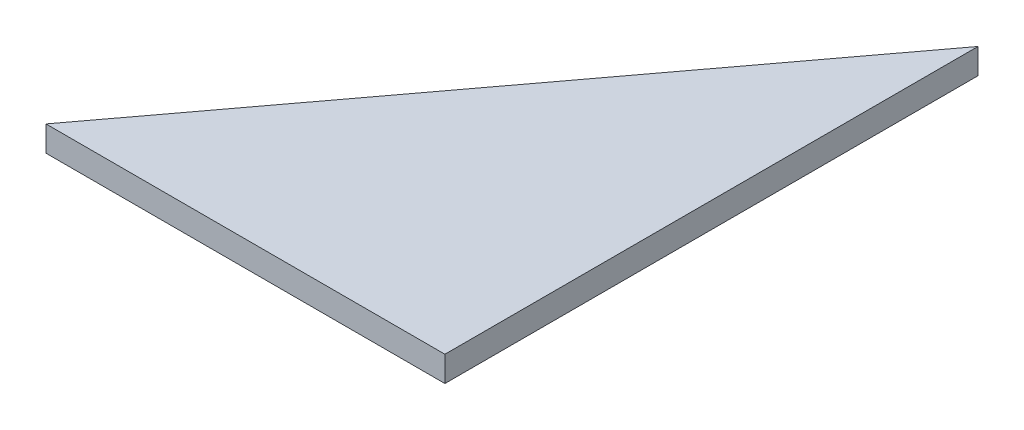
ISO-10303-21;
HEADER;
FILE_DESCRIPTION(('STEP AP214'),'2;1');
FILE_NAME('part.step','',(''),(''),'','','');
FILE_SCHEMA(('AUTOMOTIVE_DESIGN { 1 0 10303 214 1 1 1 1 }'));
ENDSEC;
DATA;
#1=APPLICATION_CONTEXT('core data for automotive mechanical design processes');
#2=APPLICATION_PROTOCOL_DEFINITION('international standard','automotive_design',2000,#1);
#3=PRODUCT_CONTEXT('',#1,'mechanical');
#4=PRODUCT('Part','Part','',(#3));
#5=PRODUCT_RELATED_PRODUCT_CATEGORY('part','',(#4));
#6=PRODUCT_DEFINITION_FORMATION('','',#4);
#7=PRODUCT_DEFINITION_CONTEXT('part definition',#1,'design');
#8=PRODUCT_DEFINITION('design','',#6,#7);
#9=PRODUCT_DEFINITION_SHAPE('','',#8);
#10=(LENGTH_UNIT() NAMED_UNIT(*) SI_UNIT(.MILLI.,.METRE.));
#11=(NAMED_UNIT(*) PLANE_ANGLE_UNIT() SI_UNIT($,.RADIAN.));
#12=(NAMED_UNIT(*) SI_UNIT($,.STERADIAN.) SOLID_ANGLE_UNIT());
#13=UNCERTAINTY_MEASURE_WITH_UNIT(LENGTH_MEASURE(1.E-05),#10,'distance_accuracy_value','');
#14=(GEOMETRIC_REPRESENTATION_CONTEXT(3) GLOBAL_UNCERTAINTY_ASSIGNED_CONTEXT((#13)) GLOBAL_UNIT_ASSIGNED_CONTEXT((#10,
#11,#12)) REPRESENTATION_CONTEXT('',''));
#15=CARTESIAN_POINT('',(0.,0.,0.));
#16=DIRECTION('',(0.,0.,1.));
#17=DIRECTION('',(1.,0.,0.));
#18=AXIS2_PLACEMENT_3D('',#15,#16,#17);
#19=CARTESIAN_POINT('',(15.2165598143673,3.5,-68.651393227376));
#20=DIRECTION('',(0.800653119732628,0.,0.599128184833939));
#21=DIRECTION('',(0.599128184833939,0.,-0.800653119732628));
#22=AXIS2_PLACEMENT_3D('',#19,#20,#21);
#23=PLANE('',#22);
#24=DIRECTION('',(-0.599128184833939,0.,0.800653119732628));
#25=VECTOR('',#24,1.);
#26=CARTESIAN_POINT('',(15.2165598143673,0.,-68.651393227376));
#27=LINE('',#26,#25);
#28=CARTESIAN_POINT('',(15.2165598143673,0.,-68.651393227376));
#29=VERTEX_POINT('',#28);
#30=CARTESIAN_POINT('',(-39.7834401856327,0.,4.84860677262398));
#31=VERTEX_POINT('',#30);
#32=EDGE_CURVE('E93',#29,#31,#27,.T.);
#33=ORIENTED_EDGE('',*,*,#32,.T.);
#34=DIRECTION('',(0.,-1.,0.));
#35=VECTOR('',#34,1.);
#36=CARTESIAN_POINT('',(-39.7834401856327,3.5,4.84860677262398));
#37=LINE('',#36,#35);
#38=CARTESIAN_POINT('',(-39.7834401856327,3.5,4.84860677262398));
#39=VERTEX_POINT('',#38);
#40=EDGE_CURVE('E11',#39,#31,#37,.T.);
#41=ORIENTED_EDGE('',*,*,#40,.F.);
#42=DIRECTION('',(-0.599128184833939,0.,0.800653119732628));
#43=VECTOR('',#42,1.);
#44=CARTESIAN_POINT('',(15.2165598143673,3.5,-68.651393227376));
#45=LINE('',#44,#43);
#46=CARTESIAN_POINT('',(15.2165598143673,3.5,-68.651393227376));
#47=VERTEX_POINT('',#46);
#48=EDGE_CURVE('E85',#47,#39,#45,.T.);
#49=ORIENTED_EDGE('',*,*,#48,.F.);
#50=DIRECTION('',(0.,-1.,0.));
#51=VECTOR('',#50,1.);
#52=CARTESIAN_POINT('',(15.2165598143673,3.5,-68.651393227376));
#53=LINE('',#52,#51);
#54=EDGE_CURVE('E94',#47,#29,#53,.T.);
#55=ORIENTED_EDGE('',*,*,#54,.T.);
#56=EDGE_LOOP('',(#33,#41,#49,#55));
#57=FACE_BOUND('',#56,.T.);
#58=ADVANCED_FACE('F43',(#57),#23,.F.);
#59=CARTESIAN_POINT('',(-39.7834401856327,3.5,4.84860677262398));
#60=DIRECTION('',(0.,0.,-1.));
#61=DIRECTION('',(-1.,0.,0.));
#62=AXIS2_PLACEMENT_3D('',#59,#60,#61);
#63=PLANE('',#62);
#64=DIRECTION('',(1.,0.,0.));
#65=VECTOR('',#64,1.);
#66=CARTESIAN_POINT('',(-39.7834401856327,0.,4.84860677262398));
#67=LINE('',#66,#65);
#68=CARTESIAN_POINT('',(15.2165598143673,0.,4.84860677262398));
#69=VERTEX_POINT('',#68);
#70=EDGE_CURVE('E72',#31,#69,#67,.T.);
#71=ORIENTED_EDGE('',*,*,#70,.T.);
#72=DIRECTION('',(0.,-1.,0.));
#73=VECTOR('',#72,1.);
#74=CARTESIAN_POINT('',(15.2165598143673,3.5,4.84860677262398));
#75=LINE('',#74,#73);
#76=CARTESIAN_POINT('',(15.2165598143673,3.5,4.84860677262398));
#77=VERTEX_POINT('',#76);
#78=EDGE_CURVE('E52',#77,#69,#75,.T.);
#79=ORIENTED_EDGE('',*,*,#78,.F.);
#80=DIRECTION('',(1.,0.,0.));
#81=VECTOR('',#80,1.);
#82=CARTESIAN_POINT('',(-39.7834401856327,3.5,4.84860677262398));
#83=LINE('',#82,#81);
#84=EDGE_CURVE('E80',#39,#77,#83,.T.);
#85=ORIENTED_EDGE('',*,*,#84,.F.);
#86=ORIENTED_EDGE('',*,*,#40,.T.);
#87=EDGE_LOOP('',(#71,#79,#85,#86));
#88=FACE_BOUND('',#87,.T.);
#89=ADVANCED_FACE('F81',(#88),#63,.F.);
#90=CARTESIAN_POINT('',(15.2165598143673,3.5,4.84860677262398));
#91=DIRECTION('',(-1.,0.,0.));
#92=DIRECTION('',(0.,0.,1.));
#93=AXIS2_PLACEMENT_3D('',#90,#91,#92);
#94=PLANE('',#93);
#95=DIRECTION('',(0.,0.,-1.));
#96=VECTOR('',#95,1.);
#97=CARTESIAN_POINT('',(15.2165598143673,0.,4.84860677262398));
#98=LINE('',#97,#96);
#99=EDGE_CURVE('E77',#69,#29,#98,.T.);
#100=ORIENTED_EDGE('',*,*,#99,.T.);
#101=ORIENTED_EDGE('',*,*,#54,.F.);
#102=DIRECTION('',(0.,0.,-1.));
#103=VECTOR('',#102,1.);
#104=CARTESIAN_POINT('',(15.2165598143673,3.5,4.84860677262398));
#105=LINE('',#104,#103);
#106=EDGE_CURVE('E60',#77,#47,#105,.T.);
#107=ORIENTED_EDGE('',*,*,#106,.F.);
#108=ORIENTED_EDGE('',*,*,#78,.T.);
#109=EDGE_LOOP('',(#100,#101,#107,#108));
#110=FACE_BOUND('',#109,.T.);
#111=ADVANCED_FACE('F106',(#110),#94,.F.);
#112=CARTESIAN_POINT('',(0.,3.5,0.));
#113=DIRECTION('',(0.,1.,0.));
#114=DIRECTION('',(0.,0.,1.));
#115=AXIS2_PLACEMENT_3D('',#112,#113,#114);
#116=PLANE('',#115);
#117=ORIENTED_EDGE('',*,*,#48,.T.);
#118=ORIENTED_EDGE('',*,*,#84,.T.);
#119=ORIENTED_EDGE('',*,*,#106,.T.);
#120=EDGE_LOOP('',(#117,#118,#119));
#121=FACE_BOUND('',#120,.T.);
#122=ADVANCED_FACE('F88',(#121),#116,.T.);
#123=CARTESIAN_POINT('',(0.,0.,0.));
#124=DIRECTION('',(0.,1.,0.));
#125=DIRECTION('',(0.,0.,1.));
#126=AXIS2_PLACEMENT_3D('',#123,#124,#125);
#127=PLANE('',#126);
#128=ORIENTED_EDGE('',*,*,#32,.F.);
#129=ORIENTED_EDGE('',*,*,#99,.F.);
#130=ORIENTED_EDGE('',*,*,#70,.F.);
#131=EDGE_LOOP('',(#128,#129,#130));
#132=FACE_BOUND('',#131,.T.);
#133=ADVANCED_FACE('F107',(#132),#127,.F.);
#134=CLOSED_SHELL('',(#58,#89,#111,#122,#133));
#135=MANIFOLD_SOLID_BREP('B2',#134);
#136=ADVANCED_BREP_SHAPE_REPRESENTATION('',(#18,#135),#14);
#137=SHAPE_DEFINITION_REPRESENTATION(#9,#136);
ENDSEC;
END-ISO-10303-21;
